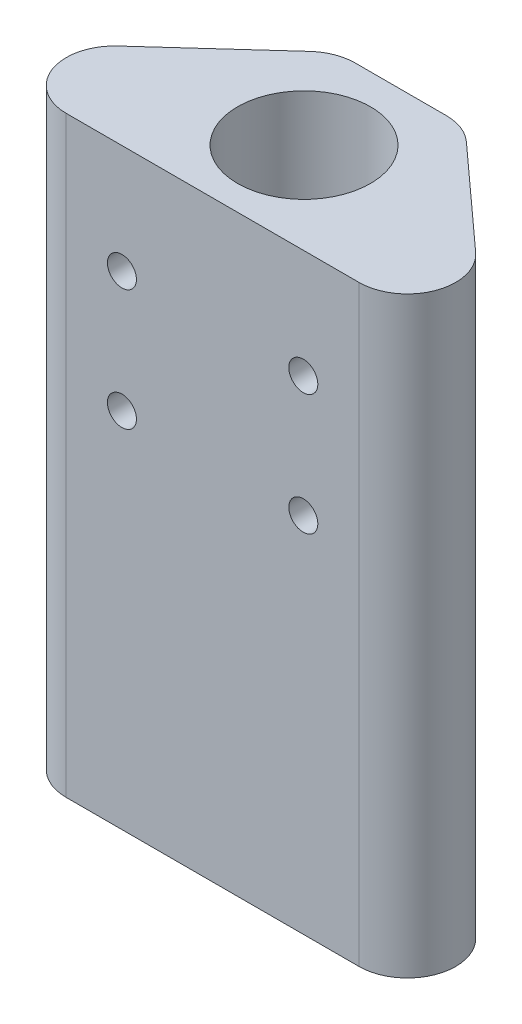
ISO-10303-21;
HEADER;
FILE_DESCRIPTION(('STEP AP214'),'2;1');
FILE_NAME('part.step','',(''),(''),'','','');
FILE_SCHEMA(('AUTOMOTIVE_DESIGN { 1 0 10303 214 1 1 1 1 }'));
ENDSEC;
DATA;
#1=APPLICATION_CONTEXT('core data for automotive mechanical design processes');
#2=APPLICATION_PROTOCOL_DEFINITION('international standard','automotive_design',2000,#1);
#3=PRODUCT_CONTEXT('',#1,'mechanical');
#4=PRODUCT('Part','Part','',(#3));
#5=PRODUCT_RELATED_PRODUCT_CATEGORY('part','',(#4));
#6=PRODUCT_DEFINITION_FORMATION('','',#4);
#7=PRODUCT_DEFINITION_CONTEXT('part definition',#1,'design');
#8=PRODUCT_DEFINITION('design','',#6,#7);
#9=PRODUCT_DEFINITION_SHAPE('','',#8);
#10=(LENGTH_UNIT() NAMED_UNIT(*) SI_UNIT(.MILLI.,.METRE.));
#11=(NAMED_UNIT(*) PLANE_ANGLE_UNIT() SI_UNIT($,.RADIAN.));
#12=(NAMED_UNIT(*) SI_UNIT($,.STERADIAN.) SOLID_ANGLE_UNIT());
#13=UNCERTAINTY_MEASURE_WITH_UNIT(LENGTH_MEASURE(1.E-05),#10,'distance_accuracy_value','');
#14=(GEOMETRIC_REPRESENTATION_CONTEXT(3) GLOBAL_UNCERTAINTY_ASSIGNED_CONTEXT((#13)) GLOBAL_UNIT_ASSIGNED_CONTEXT((#10,
#11,#12)) REPRESENTATION_CONTEXT('',''));
#15=CARTESIAN_POINT('',(0.,0.,0.));
#16=DIRECTION('',(0.,0.,1.));
#17=DIRECTION('',(1.,0.,0.));
#18=AXIS2_PLACEMENT_3D('',#15,#16,#17);
#19=CARTESIAN_POINT('',(0.,49.,0.));
#20=DIRECTION('',(0.,-1.,0.));
#21=DIRECTION('',(0.,0.,-1.));
#22=AXIS2_PLACEMENT_3D('',#19,#20,#21);
#23=PLANE('',#22);
#24=CARTESIAN_POINT('',(0.,49.,0.));
#25=DIRECTION('',(0.,1.,0.));
#26=DIRECTION('',(0.,0.,1.));
#27=AXIS2_PLACEMENT_3D('',#24,#25,#26);
#28=CIRCLE('',#27,5.5);
#29=CARTESIAN_POINT('',(0.,49.,5.5));
#30=VERTEX_POINT('',#29);
#31=EDGE_CURVE('E260',#30,#30,#28,.T.);
#32=ORIENTED_EDGE('',*,*,#31,.F.);
#33=EDGE_LOOP('',(#32));
#34=FACE_BOUND('',#33,.T.);
#35=DIRECTION('',(-0.740570076440376,0.,-0.671979137980559));
#36=VECTOR('',#35,1.);
#37=CARTESIAN_POINT('',(5.32075950932338,49.,-8.));
#38=LINE('',#37,#36);
#39=CARTESIAN_POINT('',(14.7960743982796,49.,0.597719694238491));
#40=VERTEX_POINT('',#39);
#41=CARTESIAN_POINT('',(6.46440238430222,49.,-6.96228030576151));
#42=VERTEX_POINT('',#41);
#43=EDGE_CURVE('E279',#40,#42,#38,.T.);
#44=ORIENTED_EDGE('',*,*,#43,.T.);
#45=CARTESIAN_POINT('',(3.77648583237998,49.,-4.));
#46=DIRECTION('',(0.,-1.,0.));
#47=DIRECTION('',(0.,0.,-1.));
#48=AXIS2_PLACEMENT_3D('',#45,#46,#47);
#49=CIRCLE('',#48,4.);
#50=CARTESIAN_POINT('',(3.77648583237998,49.,-8.));
#51=VERTEX_POINT('',#50);
#52=EDGE_CURVE('E161',#42,#51,#49,.F.);
#53=ORIENTED_EDGE('',*,*,#52,.T.);
#54=DIRECTION('',(-1.,0.,0.));
#55=VECTOR('',#54,1.);
#56=CARTESIAN_POINT('',(-5.32075950932338,49.,-8.));
#57=LINE('',#56,#55);
#58=CARTESIAN_POINT('',(-3.77648583237998,49.,-8.));
#59=VERTEX_POINT('',#58);
#60=EDGE_CURVE('E269',#51,#59,#57,.T.);
#61=ORIENTED_EDGE('',*,*,#60,.T.);
#62=CARTESIAN_POINT('',(-3.77648583237998,49.,-4.));
#63=DIRECTION('',(0.,-1.,0.));
#64=DIRECTION('',(0.,0.,-1.));
#65=AXIS2_PLACEMENT_3D('',#62,#63,#64);
#66=CIRCLE('',#65,4.);
#67=CARTESIAN_POINT('',(-6.46440238430222,49.,-6.96228030576151));
#68=VERTEX_POINT('',#67);
#69=EDGE_CURVE('E314',#59,#68,#66,.F.);
#70=ORIENTED_EDGE('',*,*,#69,.T.);
#71=DIRECTION('',(-0.740570076440376,0.,0.671979137980559));
#72=VECTOR('',#71,1.);
#73=CARTESIAN_POINT('',(-5.32075950932338,49.,-8.));
#74=LINE('',#73,#72);
#75=CARTESIAN_POINT('',(-14.7960743982796,49.,0.597719694238491));
#76=VERTEX_POINT('',#75);
#77=EDGE_CURVE('E272',#68,#76,#74,.T.);
#78=ORIENTED_EDGE('',*,*,#77,.T.);
#79=CARTESIAN_POINT('',(-12.1081578463573,49.,3.56));
#80=DIRECTION('',(0.,-1.,0.));
#81=DIRECTION('',(0.,0.,-1.));
#82=AXIS2_PLACEMENT_3D('',#79,#80,#81);
#83=CIRCLE('',#82,4.);
#84=CARTESIAN_POINT('',(-12.1081578463573,49.,7.56));
#85=VERTEX_POINT('',#84);
#86=EDGE_CURVE('E309',#76,#85,#83,.F.);
#87=ORIENTED_EDGE('',*,*,#86,.T.);
#88=DIRECTION('',(1.,0.,0.));
#89=VECTOR('',#88,1.);
#90=CARTESIAN_POINT('',(-22.4690156650757,49.,7.56));
#91=LINE('',#90,#89);
#92=CARTESIAN_POINT('',(12.1081578463573,49.,7.56));
#93=VERTEX_POINT('',#92);
#94=EDGE_CURVE('E276',#85,#93,#91,.T.);
#95=ORIENTED_EDGE('',*,*,#94,.T.);
#96=CARTESIAN_POINT('',(12.1081578463573,49.,3.56));
#97=DIRECTION('',(0.,-1.,0.));
#98=DIRECTION('',(0.,0.,-1.));
#99=AXIS2_PLACEMENT_3D('',#96,#97,#98);
#100=CIRCLE('',#99,4.);
#101=EDGE_CURVE('E312',#93,#40,#100,.F.);
#102=ORIENTED_EDGE('',*,*,#101,.T.);
#103=EDGE_LOOP('',(#44,#53,#61,#70,#78,#87,#95,#102));
#104=FACE_BOUND('',#103,.T.);
#105=ADVANCED_FACE('F38',(#34,#104),#23,.F.);
#106=CARTESIAN_POINT('',(0.,0.,0.));
#107=DIRECTION('',(0.,-1.,0.));
#108=DIRECTION('',(0.,0.,-1.));
#109=AXIS2_PLACEMENT_3D('',#106,#107,#108);
#110=PLANE('',#109);
#111=DIRECTION('',(-1.,0.,0.));
#112=VECTOR('',#111,1.);
#113=CARTESIAN_POINT('',(-5.32075950932338,0.,-8.));
#114=LINE('',#113,#112);
#115=CARTESIAN_POINT('',(3.77648583237998,0.,-8.));
#116=VERTEX_POINT('',#115);
#117=CARTESIAN_POINT('',(-3.77648583237998,0.,-8.));
#118=VERTEX_POINT('',#117);
#119=EDGE_CURVE('E268',#116,#118,#114,.T.);
#120=ORIENTED_EDGE('',*,*,#119,.F.);
#121=CARTESIAN_POINT('',(3.77648583237998,0.,-4.));
#122=DIRECTION('',(0.,-1.,0.));
#123=DIRECTION('',(0.,0.,-1.));
#124=AXIS2_PLACEMENT_3D('',#121,#122,#123);
#125=CIRCLE('',#124,4.);
#126=CARTESIAN_POINT('',(6.46440238430222,0.,-6.96228030576151));
#127=VERTEX_POINT('',#126);
#128=EDGE_CURVE('E300',#116,#127,#125,.T.);
#129=ORIENTED_EDGE('',*,*,#128,.T.);
#130=DIRECTION('',(-0.740570076440376,0.,-0.671979137980559));
#131=VECTOR('',#130,1.);
#132=CARTESIAN_POINT('',(5.32075950932338,0.,-8.));
#133=LINE('',#132,#131);
#134=CARTESIAN_POINT('',(14.7960743982796,0.,0.597719694238491));
#135=VERTEX_POINT('',#134);
#136=EDGE_CURVE('E273',#135,#127,#133,.T.);
#137=ORIENTED_EDGE('',*,*,#136,.F.);
#138=CARTESIAN_POINT('',(12.1081578463573,0.,3.56));
#139=DIRECTION('',(0.,-1.,0.));
#140=DIRECTION('',(0.,0.,-1.));
#141=AXIS2_PLACEMENT_3D('',#138,#139,#140);
#142=CIRCLE('',#141,4.);
#143=CARTESIAN_POINT('',(12.1081578463573,0.,7.56));
#144=VERTEX_POINT('',#143);
#145=EDGE_CURVE('E297',#135,#144,#142,.T.);
#146=ORIENTED_EDGE('',*,*,#145,.T.);
#147=DIRECTION('',(1.,0.,0.));
#148=VECTOR('',#147,1.);
#149=CARTESIAN_POINT('',(-22.4690156650757,0.,7.56));
#150=LINE('',#149,#148);
#151=CARTESIAN_POINT('',(-12.1081578463573,0.,7.56));
#152=VERTEX_POINT('',#151);
#153=EDGE_CURVE('E287',#152,#144,#150,.T.);
#154=ORIENTED_EDGE('',*,*,#153,.F.);
#155=CARTESIAN_POINT('',(-12.1081578463573,0.,3.56));
#156=DIRECTION('',(0.,-1.,0.));
#157=DIRECTION('',(0.,0.,-1.));
#158=AXIS2_PLACEMENT_3D('',#155,#156,#157);
#159=CIRCLE('',#158,4.);
#160=CARTESIAN_POINT('',(-14.7960743982796,0.,0.597719694238491));
#161=VERTEX_POINT('',#160);
#162=EDGE_CURVE('E295',#152,#161,#159,.T.);
#163=ORIENTED_EDGE('',*,*,#162,.T.);
#164=DIRECTION('',(-0.740570076440376,0.,0.671979137980559));
#165=VECTOR('',#164,1.);
#166=CARTESIAN_POINT('',(-5.32075950932338,0.,-8.));
#167=LINE('',#166,#165);
#168=CARTESIAN_POINT('',(-6.46440238430222,0.,-6.96228030576151));
#169=VERTEX_POINT('',#168);
#170=EDGE_CURVE('E285',#169,#161,#167,.T.);
#171=ORIENTED_EDGE('',*,*,#170,.F.);
#172=CARTESIAN_POINT('',(-3.77648583237998,0.,-4.));
#173=DIRECTION('',(0.,-1.,0.));
#174=DIRECTION('',(0.,0.,-1.));
#175=AXIS2_PLACEMENT_3D('',#172,#173,#174);
#176=CIRCLE('',#175,4.);
#177=EDGE_CURVE('E156',#169,#118,#176,.T.);
#178=ORIENTED_EDGE('',*,*,#177,.T.);
#179=EDGE_LOOP('',(#120,#129,#137,#146,#154,#163,#171,#178));
#180=FACE_BOUND('',#179,.T.);
#181=CARTESIAN_POINT('',(0.,0.,0.));
#182=DIRECTION('',(0.,1.,0.));
#183=DIRECTION('',(0.,0.,1.));
#184=AXIS2_PLACEMENT_3D('',#181,#182,#183);
#185=CIRCLE('',#184,3.25);
#186=CARTESIAN_POINT('',(0.,0.,3.25));
#187=VERTEX_POINT('',#186);
#188=EDGE_CURVE('E177',#187,#187,#185,.T.);
#189=ORIENTED_EDGE('',*,*,#188,.T.);
#190=EDGE_LOOP('',(#189));
#191=FACE_BOUND('',#190,.T.);
#192=ADVANCED_FACE('F225',(#180,#191),#110,.T.);
#193=CARTESIAN_POINT('',(-5.32075950932338,49.,-8.));
#194=DIRECTION('',(0.,0.,1.));
#195=DIRECTION('',(1.,0.,0.));
#196=AXIS2_PLACEMENT_3D('',#193,#194,#195);
#197=PLANE('',#196);
#198=ORIENTED_EDGE('',*,*,#60,.F.);
#199=DIRECTION('',(0.,-1.,0.));
#200=VECTOR('',#199,1.);
#201=CARTESIAN_POINT('',(3.77648583237998,49.,-8.));
#202=LINE('',#201,#200);
#203=EDGE_CURVE('E292',#51,#116,#202,.T.);
#204=ORIENTED_EDGE('',*,*,#203,.T.);
#205=ORIENTED_EDGE('',*,*,#119,.T.);
#206=DIRECTION('',(0.,-1.,0.));
#207=VECTOR('',#206,1.);
#208=CARTESIAN_POINT('',(-3.77648583237998,49.,-8.));
#209=LINE('',#208,#207);
#210=EDGE_CURVE('E282',#118,#59,#209,.F.);
#211=ORIENTED_EDGE('',*,*,#210,.T.);
#212=EDGE_LOOP('',(#198,#204,#205,#211));
#213=FACE_BOUND('',#212,.T.);
#214=ADVANCED_FACE('F221',(#213),#197,.F.);
#215=CARTESIAN_POINT('',(-5.32075950932338,49.,-8.));
#216=DIRECTION('',(0.671979137980559,0.,0.740570076440376));
#217=DIRECTION('',(0.740570076440376,0.,-0.671979137980559));
#218=AXIS2_PLACEMENT_3D('',#215,#216,#217);
#219=PLANE('',#218);
#220=DIRECTION('',(0.,-1.,0.));
#221=VECTOR('',#220,1.);
#222=CARTESIAN_POINT('',(-6.46440238430222,49.,-6.96228030576151));
#223=LINE('',#222,#221);
#224=CARTESIAN_POINT('',(-6.46440238430222,40.6062487759667,-6.96228030576151));
#225=VERTEX_POINT('',#224);
#226=EDGE_CURVE('E160',#68,#225,#223,.T.);
#227=ORIENTED_EDGE('',*,*,#226,.T.);
#228=CARTESIAN_POINT('',(-7.5,40.,-6.02259881547469));
#229=DIRECTION('',(0.671979137980559,0.,0.740570076440376));
#230=DIRECTION('',(-0.740570076440376,0.,0.671979137980559));
#231=AXIS2_PLACEMENT_3D('',#228,#229,#230);
#232=ELLIPSE('',#231,1.62037332883867,1.2);
#233=CARTESIAN_POINT('',(-6.46440238430222,39.3937512240333,-6.9622803057615));
#234=VERTEX_POINT('',#233);
#235=EDGE_CURVE('E150',#225,#234,#232,.T.);
#236=ORIENTED_EDGE('',*,*,#235,.T.);
#237=CARTESIAN_POINT('',(-6.46440238430222,30.6062487759667,-6.96228030576151));
#238=VERTEX_POINT('',#237);
#239=EDGE_CURVE('E149',#234,#238,#223,.T.);
#240=ORIENTED_EDGE('',*,*,#239,.T.);
#241=CARTESIAN_POINT('',(-7.5,30.,-6.02259881547469));
#242=DIRECTION('',(0.671979137980559,0.,0.740570076440376));
#243=DIRECTION('',(-0.740570076440376,0.,0.671979137980559));
#244=AXIS2_PLACEMENT_3D('',#241,#242,#243);
#245=ELLIPSE('',#244,1.62037332883867,1.2);
#246=CARTESIAN_POINT('',(-6.46440238430222,29.3937512240333,-6.9622803057615));
#247=VERTEX_POINT('',#246);
#248=EDGE_CURVE('E134',#238,#247,#245,.T.);
#249=ORIENTED_EDGE('',*,*,#248,.T.);
#250=EDGE_CURVE('E146',#247,#169,#223,.T.);
#251=ORIENTED_EDGE('',*,*,#250,.T.);
#252=ORIENTED_EDGE('',*,*,#170,.T.);
#253=DIRECTION('',(0.,-1.,0.));
#254=VECTOR('',#253,1.);
#255=CARTESIAN_POINT('',(-14.7960743982796,49.,0.597719694238493));
#256=LINE('',#255,#254);
#257=EDGE_CURVE('E158',#161,#76,#256,.F.);
#258=ORIENTED_EDGE('',*,*,#257,.T.);
#259=ORIENTED_EDGE('',*,*,#77,.F.);
#260=EDGE_LOOP('',(#227,#236,#240,#249,#251,#252,#258,#259));
#261=FACE_BOUND('',#260,.T.);
#262=ADVANCED_FACE('F144',(#261),#219,.F.);
#263=CARTESIAN_POINT('',(-22.4690156650757,49.,7.56));
#264=DIRECTION('',(0.,0.,-1.));
#265=DIRECTION('',(-1.,0.,0.));
#266=AXIS2_PLACEMENT_3D('',#263,#264,#265);
#267=PLANE('',#266);
#268=CARTESIAN_POINT('',(-7.5,40.,7.56));
#269=DIRECTION('',(0.,0.,1.));
#270=DIRECTION('',(1.,0.,0.));
#271=AXIS2_PLACEMENT_3D('',#268,#269,#270);
#272=CIRCLE('',#271,1.2);
#273=CARTESIAN_POINT('',(-6.3,40.,7.56));
#274=VERTEX_POINT('',#273);
#275=EDGE_CURVE('E341',#274,#274,#272,.T.);
#276=ORIENTED_EDGE('',*,*,#275,.F.);
#277=EDGE_LOOP('',(#276));
#278=FACE_BOUND('',#277,.T.);
#279=CARTESIAN_POINT('',(7.5,30.,7.56));
#280=DIRECTION('',(0.,0.,1.));
#281=DIRECTION('',(1.,0.,0.));
#282=AXIS2_PLACEMENT_3D('',#279,#280,#281);
#283=CIRCLE('',#282,1.2);
#284=CARTESIAN_POINT('',(8.7,30.,7.56));
#285=VERTEX_POINT('',#284);
#286=EDGE_CURVE('E342',#285,#285,#283,.T.);
#287=ORIENTED_EDGE('',*,*,#286,.F.);
#288=EDGE_LOOP('',(#287));
#289=FACE_BOUND('',#288,.T.);
#290=CARTESIAN_POINT('',(-7.5,30.,7.56));
#291=DIRECTION('',(0.,0.,1.));
#292=DIRECTION('',(1.,0.,0.));
#293=AXIS2_PLACEMENT_3D('',#290,#291,#292);
#294=CIRCLE('',#293,1.2);
#295=CARTESIAN_POINT('',(-6.3,30.,7.56));
#296=VERTEX_POINT('',#295);
#297=EDGE_CURVE('E345',#296,#296,#294,.T.);
#298=ORIENTED_EDGE('',*,*,#297,.F.);
#299=EDGE_LOOP('',(#298));
#300=FACE_BOUND('',#299,.T.);
#301=CARTESIAN_POINT('',(7.5,40.,7.56));
#302=DIRECTION('',(0.,0.,1.));
#303=DIRECTION('',(1.,0.,0.));
#304=AXIS2_PLACEMENT_3D('',#301,#302,#303);
#305=CIRCLE('',#304,1.2);
#306=CARTESIAN_POINT('',(8.7,40.,7.56));
#307=VERTEX_POINT('',#306);
#308=EDGE_CURVE('E151',#307,#307,#305,.T.);
#309=ORIENTED_EDGE('',*,*,#308,.F.);
#310=EDGE_LOOP('',(#309));
#311=FACE_BOUND('',#310,.T.);
#312=ORIENTED_EDGE('',*,*,#153,.T.);
#313=DIRECTION('',(0.,-1.,0.));
#314=VECTOR('',#313,1.);
#315=CARTESIAN_POINT('',(12.1081578463573,49.,7.56));
#316=LINE('',#315,#314);
#317=EDGE_CURVE('E140',#144,#93,#316,.F.);
#318=ORIENTED_EDGE('',*,*,#317,.T.);
#319=ORIENTED_EDGE('',*,*,#94,.F.);
#320=DIRECTION('',(0.,-1.,0.));
#321=VECTOR('',#320,1.);
#322=CARTESIAN_POINT('',(-12.1081578463573,49.,7.56));
#323=LINE('',#322,#321);
#324=EDGE_CURVE('E164',#85,#152,#323,.T.);
#325=ORIENTED_EDGE('',*,*,#324,.T.);
#326=EDGE_LOOP('',(#312,#318,#319,#325));
#327=FACE_BOUND('',#326,.T.);
#328=ADVANCED_FACE('F229',(#278,#289,#300,#311,#327),#267,.F.);
#329=CARTESIAN_POINT('',(5.32075950932338,49.,-8.));
#330=DIRECTION('',(-0.671979137980559,0.,0.740570076440376));
#331=DIRECTION('',(0.740570076440376,0.,0.671979137980559));
#332=AXIS2_PLACEMENT_3D('',#329,#330,#331);
#333=PLANE('',#332);
#334=DIRECTION('',(0.,-1.,0.));
#335=VECTOR('',#334,1.);
#336=CARTESIAN_POINT('',(6.46440238430222,49.,-6.96228030576151));
#337=LINE('',#336,#335);
#338=CARTESIAN_POINT('',(6.46440238430222,29.3937512240334,-6.96228030576151));
#339=VERTEX_POINT('',#338);
#340=EDGE_CURVE('E306',#127,#339,#337,.F.);
#341=ORIENTED_EDGE('',*,*,#340,.T.);
#342=CARTESIAN_POINT('',(7.5,30.,-6.02259881547468));
#343=DIRECTION('',(-0.671979137980559,0.,0.740570076440376));
#344=DIRECTION('',(0.740570076440376,0.,0.671979137980559));
#345=AXIS2_PLACEMENT_3D('',#342,#343,#344);
#346=ELLIPSE('',#345,1.62037332883867,1.2);
#347=CARTESIAN_POINT('',(6.46440238430222,30.6062487759667,-6.96228030576151));
#348=VERTEX_POINT('',#347);
#349=EDGE_CURVE('E64',#339,#348,#346,.T.);
#350=ORIENTED_EDGE('',*,*,#349,.T.);
#351=CARTESIAN_POINT('',(6.46440238430222,39.3937512240334,-6.96228030576151));
#352=VERTEX_POINT('',#351);
#353=EDGE_CURVE('E310',#348,#352,#337,.F.);
#354=ORIENTED_EDGE('',*,*,#353,.T.);
#355=CARTESIAN_POINT('',(7.5,40.,-6.02259881547468));
#356=DIRECTION('',(-0.671979137980559,0.,0.740570076440376));
#357=DIRECTION('',(0.740570076440376,0.,0.671979137980559));
#358=AXIS2_PLACEMENT_3D('',#355,#356,#357);
#359=ELLIPSE('',#358,1.62037332883867,1.2);
#360=CARTESIAN_POINT('',(6.46440238430222,40.6062487759667,-6.96228030576151));
#361=VERTEX_POINT('',#360);
#362=EDGE_CURVE('E58',#352,#361,#359,.T.);
#363=ORIENTED_EDGE('',*,*,#362,.T.);
#364=EDGE_CURVE('E305',#361,#42,#337,.F.);
#365=ORIENTED_EDGE('',*,*,#364,.T.);
#366=ORIENTED_EDGE('',*,*,#43,.F.);
#367=DIRECTION('',(0.,-1.,0.));
#368=VECTOR('',#367,1.);
#369=CARTESIAN_POINT('',(14.7960743982796,49.,0.59771969423849));
#370=LINE('',#369,#368);
#371=EDGE_CURVE('E302',#40,#135,#370,.T.);
#372=ORIENTED_EDGE('',*,*,#371,.T.);
#373=ORIENTED_EDGE('',*,*,#136,.T.);
#374=EDGE_LOOP('',(#341,#350,#354,#363,#365,#366,#372,#373));
#375=FACE_BOUND('',#374,.T.);
#376=ADVANCED_FACE('F232',(#375),#333,.F.);
#377=CARTESIAN_POINT('',(0.,49.,0.));
#378=DIRECTION('',(0.,-1.,0.));
#379=DIRECTION('',(0.,0.,-1.));
#380=AXIS2_PLACEMENT_3D('',#377,#378,#379);
#381=CYLINDRICAL_SURFACE('',#380,3.25);
#382=CARTESIAN_POINT('',(0.,16.,0.));
#383=DIRECTION('',(0.,-1.,0.));
#384=DIRECTION('',(0.,0.,-1.));
#385=AXIS2_PLACEMENT_3D('',#382,#383,#384);
#386=CIRCLE('',#385,3.25);
#387=CARTESIAN_POINT('',(0.,16.,-3.25));
#388=VERTEX_POINT('',#387);
#389=EDGE_CURVE('E175',#388,#388,#386,.T.);
#390=ORIENTED_EDGE('',*,*,#389,.F.);
#391=EDGE_LOOP('',(#390));
#392=FACE_BOUND('',#391,.T.);
#393=ORIENTED_EDGE('',*,*,#188,.F.);
#394=EDGE_LOOP('',(#393));
#395=FACE_BOUND('',#394,.T.);
#396=ADVANCED_FACE('F219',(#392,#395),#381,.F.);
#397=CARTESIAN_POINT('',(3.77648583237998,49.,-4.));
#398=DIRECTION('',(0.,-1.,0.));
#399=DIRECTION('',(0.,0.,-1.));
#400=AXIS2_PLACEMENT_3D('',#397,#398,#399);
#401=CYLINDRICAL_SURFACE('',#400,4.);
#402=CARTESIAN_POINT('',(6.46440238430222,29.3937512240334,-6.96228030576151));
#403=CARTESIAN_POINT('',(6.45173609315554,29.415386745901,-6.97377363522932));
#404=CARTESIAN_POINT('',(6.43960651808338,29.4376645870041,-6.98463151957145));
#405=CARTESIAN_POINT('',(6.4165697907023,29.4834378358533,-7.00502794540358));
#406=CARTESIAN_POINT('',(6.4056632172817,29.5069338125541,-7.01456586260417));
#407=CARTESIAN_POINT('',(6.37498656630002,29.5791929871874,-7.04113958332763));
#408=CARTESIAN_POINT('',(6.35730074119732,29.6296582871409,-7.05609853728049));
#409=CARTESIAN_POINT('',(6.32860811676767,29.7339595748867,-7.08010189973493));
#410=CARTESIAN_POINT('',(6.31762137411748,29.7878051574223,-7.08912855348064));
#411=CARTESIAN_POINT('',(6.30315675336495,29.897070574295,-7.10097141718417));
#412=CARTESIAN_POINT('',(6.29966393013175,29.9524870516142,-7.10379998822509));
#413=CARTESIAN_POINT('',(6.30037191050546,30.060838916777,-7.10322372411273));
#414=CARTESIAN_POINT('',(6.30424757672942,30.1137782879422,-7.10008231899054));
#415=CARTESIAN_POINT('',(6.31881481940155,30.2181368231989,-7.08814682765912));
#416=CARTESIAN_POINT('',(6.32951806636284,30.2695532262734,-7.07934306245695));
#417=CARTESIAN_POINT('',(6.35762949736942,30.3713190225526,-7.05582099537917));
#418=CARTESIAN_POINT('',(6.37527666348228,30.4215539194605,-7.04089096541179));
#419=CARTESIAN_POINT('',(6.40586201200823,30.4935020210364,-7.01439230446021));
#420=CARTESIAN_POINT('',(6.41673556664254,30.5169050427782,-7.00488203359991));
#421=CARTESIAN_POINT('',(6.43969635659729,30.5625003034271,-6.98455110230331));
#422=CARTESIAN_POINT('',(6.45178298486987,30.58469313944,-6.97373109673299));
#423=CARTESIAN_POINT('',(6.46440238430222,30.6062487759667,-6.96228030576151));
#424=B_SPLINE_CURVE_WITH_KNOTS('',3,(#402,#403,#404,#405,#406,#407,#408,#409,#410,#411,#412,
#413,#414,#415,#416,#417,#418,#419,#420,#421,#422,#423),.UNSPECIFIED.,.F.,.F.,(4,2,2,2,2,2,2,2,
2,2,4),(0.,0.0827003799606569,0.165439741047345,0.331180894515192,0.497415861900351,
0.663318997377438,0.82207102616318,0.981095142598756,1.14615272778768,1.22858810497514,
1.31098243350554),.UNSPECIFIED.);
#425=EDGE_CURVE('E12',#339,#348,#424,.T.);
#426=ORIENTED_EDGE('',*,*,#425,.F.);
#427=ORIENTED_EDGE('',*,*,#340,.F.);
#428=ORIENTED_EDGE('',*,*,#128,.F.);
#429=ORIENTED_EDGE('',*,*,#203,.F.);
#430=ORIENTED_EDGE('',*,*,#52,.F.);
#431=ORIENTED_EDGE('',*,*,#364,.F.);
#432=CARTESIAN_POINT('',(6.46440238430222,39.3937512240334,-6.96228030576151));
#433=CARTESIAN_POINT('',(6.45173609315554,39.415386745901,-6.97377363522932));
#434=CARTESIAN_POINT('',(6.43960651808337,39.4376645870041,-6.98463151957145));
#435=CARTESIAN_POINT('',(6.41656979070229,39.4834378358533,-7.00502794540359));
#436=CARTESIAN_POINT('',(6.4056632172817,39.5069338125542,-7.01456586260417));
#437=CARTESIAN_POINT('',(6.37498656630002,39.5791929871874,-7.04113958332763));
#438=CARTESIAN_POINT('',(6.35730074119731,39.6296582871409,-7.05609853728049));
#439=CARTESIAN_POINT('',(6.32860811676767,39.7339595748867,-7.08010189973493));
#440=CARTESIAN_POINT('',(6.31762137411749,39.7878051574223,-7.08912855348064));
#441=CARTESIAN_POINT('',(6.30315675336495,39.897070574295,-7.10097141718417));
#442=CARTESIAN_POINT('',(6.29966393013175,39.9524870516142,-7.10379998822509));
#443=CARTESIAN_POINT('',(6.30037191050546,40.060838916777,-7.10322372411273));
#444=CARTESIAN_POINT('',(6.30424757672942,40.1137782879422,-7.10008231899055));
#445=CARTESIAN_POINT('',(6.31881481940155,40.2181368231989,-7.08814682765912));
#446=CARTESIAN_POINT('',(6.32951806636284,40.2695532262734,-7.07934306245696));
#447=CARTESIAN_POINT('',(6.35762949736942,40.3713190225526,-7.05582099537917));
#448=CARTESIAN_POINT('',(6.37527666348228,40.4215539194605,-7.04089096541179));
#449=CARTESIAN_POINT('',(6.40586201200823,40.4935020210364,-7.01439230446021));
#450=CARTESIAN_POINT('',(6.41673556664254,40.5169050427782,-7.00488203359991));
#451=CARTESIAN_POINT('',(6.43969635659729,40.5625003034271,-6.98455110230331));
#452=CARTESIAN_POINT('',(6.45178298486987,40.58469313944,-6.97373109673298));
#453=CARTESIAN_POINT('',(6.46440238430222,40.6062487759667,-6.96228030576151));
#454=B_SPLINE_CURVE_WITH_KNOTS('',3,(#432,#433,#434,#435,#436,#437,#438,#439,#440,#441,#442,
#443,#444,#445,#446,#447,#448,#449,#450,#451,#452,#453),.UNSPECIFIED.,.F.,.F.,(4,2,2,2,2,2,2,2,
2,2,4),(0.,0.0827003799606643,0.165439741047353,0.331180894515192,0.497415861900344,
0.663318997377431,0.822071026163165,0.981095142598748,1.14615272778768,1.22858810497514,
1.31098243350554),.UNSPECIFIED.);
#455=EDGE_CURVE('E52',#352,#361,#454,.T.);
#456=ORIENTED_EDGE('',*,*,#455,.F.);
#457=ORIENTED_EDGE('',*,*,#353,.F.);
#458=EDGE_LOOP('',(#426,#427,#428,#429,#430,#431,#456,#457));
#459=FACE_BOUND('',#458,.T.);
#460=ADVANCED_FACE('F215',(#459),#401,.T.);
#461=CARTESIAN_POINT('',(-3.77648583237998,49.,-4.));
#462=DIRECTION('',(0.,-1.,0.));
#463=DIRECTION('',(0.,0.,-1.));
#464=AXIS2_PLACEMENT_3D('',#461,#462,#463);
#465=CYLINDRICAL_SURFACE('',#464,4.);
#466=CARTESIAN_POINT('',(-6.46440238430222,40.6062487759667,-6.9622803057615));
#467=CARTESIAN_POINT('',(-6.45173609315555,40.584613254099,-6.97377363522932));
#468=CARTESIAN_POINT('',(-6.43960651808338,40.5623354129959,-6.98463151957145));
#469=CARTESIAN_POINT('',(-6.4165697907023,40.5165621641468,-7.00502794540358));
#470=CARTESIAN_POINT('',(-6.4056632172817,40.4930661874459,-7.01456586260417));
#471=CARTESIAN_POINT('',(-6.37498656630002,40.4208070128126,-7.04113958332762));
#472=CARTESIAN_POINT('',(-6.35730074119732,40.3703417128592,-7.05609853728049));
#473=CARTESIAN_POINT('',(-6.32860811676767,40.2660404251133,-7.08010189973493));
#474=CARTESIAN_POINT('',(-6.31762137411749,40.2121948425777,-7.08912855348064));
#475=CARTESIAN_POINT('',(-6.30315675336495,40.102929425705,-7.10097141718417));
#476=CARTESIAN_POINT('',(-6.29966393013175,40.0475129483858,-7.10379998822509));
#477=CARTESIAN_POINT('',(-6.30037191050546,39.939161083223,-7.10322372411273));
#478=CARTESIAN_POINT('',(-6.30424757672942,39.8862217120579,-7.10008231899054));
#479=CARTESIAN_POINT('',(-6.31881481940155,39.7818631768011,-7.08814682765912));
#480=CARTESIAN_POINT('',(-6.32951806636284,39.7304467737266,-7.07934306245696));
#481=CARTESIAN_POINT('',(-6.35762949736941,39.6286809774475,-7.05582099537917));
#482=CARTESIAN_POINT('',(-6.37527666348227,39.5784460805395,-7.04089096541179));
#483=CARTESIAN_POINT('',(-6.40586201200823,39.5064979789636,-7.0143923044602));
#484=CARTESIAN_POINT('',(-6.41673556664254,39.4830949572218,-7.00488203359991));
#485=CARTESIAN_POINT('',(-6.43969635659729,39.4374996965729,-6.98455110230331));
#486=CARTESIAN_POINT('',(-6.45178298486987,39.41530686056,-6.97373109673298));
#487=CARTESIAN_POINT('',(-6.46440238430222,39.3937512240333,-6.9622803057615));
#488=B_SPLINE_CURVE_WITH_KNOTS('',3,(#466,#467,#468,#469,#470,#471,#472,#473,#474,#475,#476,
#477,#478,#479,#480,#481,#482,#483,#484,#485,#486,#487),.UNSPECIFIED.,.F.,.F.,(4,2,2,2,2,2,2,2,
2,2,4),(0.,0.0827003799606554,0.165439741047337,0.331180894515185,0.497415861900345,
0.663318997377425,0.822071026163166,0.981095142598741,1.14615272778768,1.22858810497515,
1.31098243350556),.UNSPECIFIED.);
#489=EDGE_CURVE('E139',#225,#234,#488,.T.);
#490=ORIENTED_EDGE('',*,*,#489,.F.);
#491=ORIENTED_EDGE('',*,*,#226,.F.);
#492=ORIENTED_EDGE('',*,*,#69,.F.);
#493=ORIENTED_EDGE('',*,*,#210,.F.);
#494=ORIENTED_EDGE('',*,*,#177,.F.);
#495=ORIENTED_EDGE('',*,*,#250,.F.);
#496=CARTESIAN_POINT('',(-6.46440238430222,30.6062487759667,-6.9622803057615));
#497=CARTESIAN_POINT('',(-6.45173609315554,30.584613254099,-6.97377363522932));
#498=CARTESIAN_POINT('',(-6.43960651808338,30.5623354129959,-6.98463151957145));
#499=CARTESIAN_POINT('',(-6.4165697907023,30.5165621641468,-7.00502794540358));
#500=CARTESIAN_POINT('',(-6.4056632172817,30.4930661874459,-7.01456586260417));
#501=CARTESIAN_POINT('',(-6.37498656630002,30.4208070128126,-7.04113958332762));
#502=CARTESIAN_POINT('',(-6.35730074119732,30.3703417128591,-7.05609853728049));
#503=CARTESIAN_POINT('',(-6.32860811676767,30.2660404251133,-7.08010189973493));
#504=CARTESIAN_POINT('',(-6.31762137411748,30.2121948425777,-7.08912855348064));
#505=CARTESIAN_POINT('',(-6.30315675336495,30.102929425705,-7.10097141718417));
#506=CARTESIAN_POINT('',(-6.29966393013175,30.0475129483858,-7.10379998822509));
#507=CARTESIAN_POINT('',(-6.30037191050546,29.939161083223,-7.10322372411273));
#508=CARTESIAN_POINT('',(-6.30424757672942,29.8862217120578,-7.10008231899054));
#509=CARTESIAN_POINT('',(-6.31881481940155,29.7818631768011,-7.08814682765912));
#510=CARTESIAN_POINT('',(-6.32951806636284,29.7304467737266,-7.07934306245696));
#511=CARTESIAN_POINT('',(-6.35762949736942,29.6286809774475,-7.05582099537917));
#512=CARTESIAN_POINT('',(-6.37527666348228,29.5784460805395,-7.04089096541179));
#513=CARTESIAN_POINT('',(-6.40586201200823,29.5064979789636,-7.0143923044602));
#514=CARTESIAN_POINT('',(-6.41673556664254,29.4830949572218,-7.00488203359991));
#515=CARTESIAN_POINT('',(-6.43969635659729,29.4374996965729,-6.98455110230331));
#516=CARTESIAN_POINT('',(-6.45178298486987,29.41530686056,-6.97373109673298));
#517=CARTESIAN_POINT('',(-6.46440238430222,29.3937512240333,-6.9622803057615));
#518=B_SPLINE_CURVE_WITH_KNOTS('',3,(#496,#497,#498,#499,#500,#501,#502,#503,#504,#505,#506,
#507,#508,#509,#510,#511,#512,#513,#514,#515,#516,#517),.UNSPECIFIED.,.F.,.F.,(4,2,2,2,2,2,2,2,
2,2,4),(0.,0.08270037996066,0.165439741047349,0.331180894515192,0.497415861900352,
0.663318997377439,0.822071026163181,0.981095142598753,1.14615272778769,1.22858810497515,
1.31098243350556),.UNSPECIFIED.);
#519=EDGE_CURVE('E131',#238,#247,#518,.T.);
#520=ORIENTED_EDGE('',*,*,#519,.F.);
#521=ORIENTED_EDGE('',*,*,#239,.F.);
#522=EDGE_LOOP('',(#490,#491,#492,#493,#494,#495,#520,#521));
#523=FACE_BOUND('',#522,.T.);
#524=ADVANCED_FACE('F154',(#523),#465,.T.);
#525=CARTESIAN_POINT('',(12.1081578463573,49.,3.56));
#526=DIRECTION('',(0.,-1.,0.));
#527=DIRECTION('',(0.,0.,-1.));
#528=AXIS2_PLACEMENT_3D('',#525,#526,#527);
#529=CYLINDRICAL_SURFACE('',#528,4.);
#530=ORIENTED_EDGE('',*,*,#101,.F.);
#531=ORIENTED_EDGE('',*,*,#317,.F.);
#532=ORIENTED_EDGE('',*,*,#145,.F.);
#533=ORIENTED_EDGE('',*,*,#371,.F.);
#534=EDGE_LOOP('',(#530,#531,#532,#533));
#535=FACE_BOUND('',#534,.T.);
#536=ADVANCED_FACE('F253',(#535),#529,.T.);
#537=CARTESIAN_POINT('',(-12.1081578463573,49.,3.56));
#538=DIRECTION('',(0.,-1.,0.));
#539=DIRECTION('',(0.,0.,-1.));
#540=AXIS2_PLACEMENT_3D('',#537,#538,#539);
#541=CYLINDRICAL_SURFACE('',#540,4.);
#542=ORIENTED_EDGE('',*,*,#86,.F.);
#543=ORIENTED_EDGE('',*,*,#257,.F.);
#544=ORIENTED_EDGE('',*,*,#162,.F.);
#545=ORIENTED_EDGE('',*,*,#324,.F.);
#546=EDGE_LOOP('',(#542,#543,#544,#545));
#547=FACE_BOUND('',#546,.T.);
#548=ADVANCED_FACE('F40',(#547),#541,.T.);
#549=CARTESIAN_POINT('',(0.,16.,0.));
#550=DIRECTION('',(0.,-1.,0.));
#551=DIRECTION('',(0.,0.,-1.));
#552=AXIS2_PLACEMENT_3D('',#549,#550,#551);
#553=PLANE('',#552);
#554=ORIENTED_EDGE('',*,*,#389,.T.);
#555=EDGE_LOOP('',(#554));
#556=FACE_BOUND('',#555,.T.);
#557=CARTESIAN_POINT('',(0.,16.,0.));
#558=DIRECTION('',(0.,-1.,0.));
#559=DIRECTION('',(0.,0.,-1.));
#560=AXIS2_PLACEMENT_3D('',#557,#558,#559);
#561=CIRCLE('',#560,5.5);
#562=CARTESIAN_POINT('',(0.,16.,-5.5));
#563=VERTEX_POINT('',#562);
#564=EDGE_CURVE('E178',#563,#563,#561,.F.);
#565=ORIENTED_EDGE('',*,*,#564,.T.);
#566=EDGE_LOOP('',(#565));
#567=FACE_BOUND('',#566,.T.);
#568=ADVANCED_FACE('F245',(#556,#567),#553,.F.);
#569=CARTESIAN_POINT('',(0.,-15.556349186104,0.));
#570=DIRECTION('',(0.,1.,0.));
#571=DIRECTION('',(0.,0.,1.));
#572=AXIS2_PLACEMENT_3D('',#569,#570,#571);
#573=CYLINDRICAL_SURFACE('',#572,5.5);
#574=ORIENTED_EDGE('',*,*,#31,.T.);
#575=EDGE_LOOP('',(#574));
#576=FACE_BOUND('',#575,.T.);
#577=ORIENTED_EDGE('',*,*,#564,.F.);
#578=EDGE_LOOP('',(#577));
#579=FACE_BOUND('',#578,.T.);
#580=ADVANCED_FACE('F195',(#576,#579),#573,.F.);
#581=CARTESIAN_POINT('',(-7.5,30.,-8.));
#582=DIRECTION('',(0.,0.,1.));
#583=DIRECTION('',(1.,0.,0.));
#584=AXIS2_PLACEMENT_3D('',#581,#582,#583);
#585=CYLINDRICAL_SURFACE('',#584,1.2);
#586=ORIENTED_EDGE('',*,*,#297,.T.);
#587=EDGE_LOOP('',(#586));
#588=FACE_BOUND('',#587,.T.);
#589=ORIENTED_EDGE('',*,*,#519,.T.);
#590=ORIENTED_EDGE('',*,*,#248,.F.);
#591=EDGE_LOOP('',(#589,#590));
#592=FACE_BOUND('',#591,.T.);
#593=ADVANCED_FACE('F133',(#588,#592),#585,.F.);
#594=CARTESIAN_POINT('',(-7.5,40.,-8.));
#595=DIRECTION('',(0.,0.,1.));
#596=DIRECTION('',(1.,0.,0.));
#597=AXIS2_PLACEMENT_3D('',#594,#595,#596);
#598=CYLINDRICAL_SURFACE('',#597,1.2);
#599=ORIENTED_EDGE('',*,*,#275,.T.);
#600=EDGE_LOOP('',(#599));
#601=FACE_BOUND('',#600,.T.);
#602=ORIENTED_EDGE('',*,*,#489,.T.);
#603=ORIENTED_EDGE('',*,*,#235,.F.);
#604=EDGE_LOOP('',(#602,#603));
#605=FACE_BOUND('',#604,.T.);
#606=ADVANCED_FACE('F194',(#601,#605),#598,.F.);
#607=CARTESIAN_POINT('',(7.5,40.,-8.));
#608=DIRECTION('',(0.,0.,1.));
#609=DIRECTION('',(1.,0.,0.));
#610=AXIS2_PLACEMENT_3D('',#607,#608,#609);
#611=CYLINDRICAL_SURFACE('',#610,1.2);
#612=ORIENTED_EDGE('',*,*,#308,.T.);
#613=EDGE_LOOP('',(#612));
#614=FACE_BOUND('',#613,.T.);
#615=ORIENTED_EDGE('',*,*,#455,.T.);
#616=ORIENTED_EDGE('',*,*,#362,.F.);
#617=EDGE_LOOP('',(#615,#616));
#618=FACE_BOUND('',#617,.T.);
#619=ADVANCED_FACE('F199',(#614,#618),#611,.F.);
#620=CARTESIAN_POINT('',(7.5,30.,-8.));
#621=DIRECTION('',(0.,0.,1.));
#622=DIRECTION('',(1.,0.,0.));
#623=AXIS2_PLACEMENT_3D('',#620,#621,#622);
#624=CYLINDRICAL_SURFACE('',#623,1.2);
#625=ORIENTED_EDGE('',*,*,#286,.T.);
#626=EDGE_LOOP('',(#625));
#627=FACE_BOUND('',#626,.T.);
#628=ORIENTED_EDGE('',*,*,#425,.T.);
#629=ORIENTED_EDGE('',*,*,#349,.F.);
#630=EDGE_LOOP('',(#628,#629));
#631=FACE_BOUND('',#630,.T.);
#632=ADVANCED_FACE('F201',(#627,#631),#624,.F.);
#633=CLOSED_SHELL('',(#105,#192,#214,#262,#328,#376,#396,#460,#524,#536,#548,#568,#580,#593,
#606,#619,#632));
#634=MANIFOLD_SOLID_BREP('B2',#633);
#635=ADVANCED_BREP_SHAPE_REPRESENTATION('',(#18,#634),#14);
#636=SHAPE_DEFINITION_REPRESENTATION(#9,#635);
ENDSEC;
END-ISO-10303-21;
